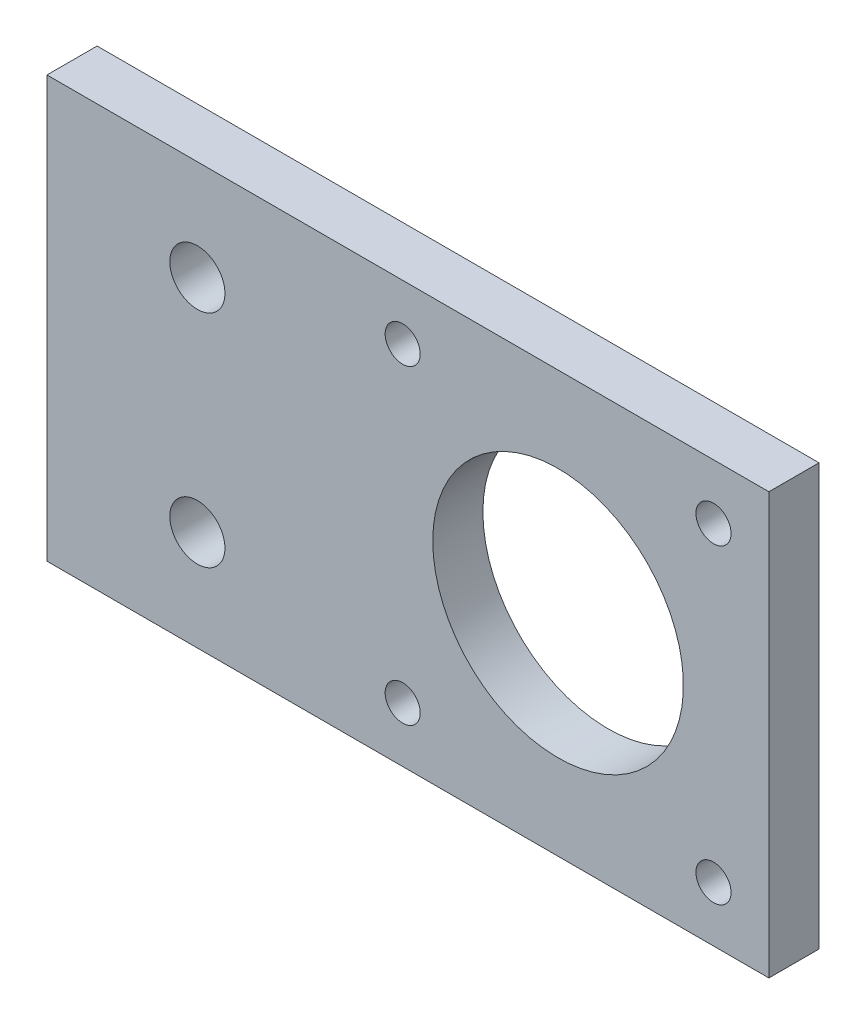
ISO-10303-21;
HEADER;
FILE_DESCRIPTION(('STEP AP214'),'2;1');
FILE_NAME('part.step','',(''),(''),'','','');
FILE_SCHEMA(('AUTOMOTIVE_DESIGN { 1 0 10303 214 1 1 1 1 }'));
ENDSEC;
DATA;
#1=APPLICATION_CONTEXT('core data for automotive mechanical design processes');
#2=APPLICATION_PROTOCOL_DEFINITION('international standard','automotive_design',2000,#1);
#3=PRODUCT_CONTEXT('',#1,'mechanical');
#4=PRODUCT('Part','Part','',(#3));
#5=PRODUCT_RELATED_PRODUCT_CATEGORY('part','',(#4));
#6=PRODUCT_DEFINITION_FORMATION('','',#4);
#7=PRODUCT_DEFINITION_CONTEXT('part definition',#1,'design');
#8=PRODUCT_DEFINITION('design','',#6,#7);
#9=PRODUCT_DEFINITION_SHAPE('','',#8);
#10=(LENGTH_UNIT() NAMED_UNIT(*) SI_UNIT(.MILLI.,.METRE.));
#11=(NAMED_UNIT(*) PLANE_ANGLE_UNIT() SI_UNIT($,.RADIAN.));
#12=(NAMED_UNIT(*) SI_UNIT($,.STERADIAN.) SOLID_ANGLE_UNIT());
#13=UNCERTAINTY_MEASURE_WITH_UNIT(LENGTH_MEASURE(1.E-05),#10,'distance_accuracy_value','');
#14=(GEOMETRIC_REPRESENTATION_CONTEXT(3) GLOBAL_UNCERTAINTY_ASSIGNED_CONTEXT((#13)) GLOBAL_UNIT_ASSIGNED_CONTEXT((#10,
#11,#12)) REPRESENTATION_CONTEXT('',''));
#15=CARTESIAN_POINT('',(0.,0.,0.));
#16=DIRECTION('',(0.,0.,1.));
#17=DIRECTION('',(1.,0.,0.));
#18=AXIS2_PLACEMENT_3D('',#15,#16,#17);
#19=CARTESIAN_POINT('',(-36.,-21.,5.));
#20=DIRECTION('',(1.,0.,0.));
#21=DIRECTION('',(0.,0.,-1.));
#22=AXIS2_PLACEMENT_3D('',#19,#20,#21);
#23=PLANE('',#22);
#24=DIRECTION('',(0.,-1.,0.));
#25=VECTOR('',#24,1.);
#26=CARTESIAN_POINT('',(-36.,-21.,0.));
#27=LINE('',#26,#25);
#28=CARTESIAN_POINT('',(-36.,21.,0.));
#29=VERTEX_POINT('',#28);
#30=CARTESIAN_POINT('',(-36.,-21.,0.));
#31=VERTEX_POINT('',#30);
#32=EDGE_CURVE('E206',#29,#31,#27,.T.);
#33=ORIENTED_EDGE('',*,*,#32,.T.);
#34=DIRECTION('',(0.,0.,-1.));
#35=VECTOR('',#34,1.);
#36=CARTESIAN_POINT('',(-36.,-21.,5.));
#37=LINE('',#36,#35);
#38=CARTESIAN_POINT('',(-36.,-21.,5.));
#39=VERTEX_POINT('',#38);
#40=EDGE_CURVE('E12',#39,#31,#37,.T.);
#41=ORIENTED_EDGE('',*,*,#40,.F.);
#42=DIRECTION('',(0.,-1.,0.));
#43=VECTOR('',#42,1.);
#44=CARTESIAN_POINT('',(-36.,-21.,5.));
#45=LINE('',#44,#43);
#46=CARTESIAN_POINT('',(-36.,21.,5.));
#47=VERTEX_POINT('',#46);
#48=EDGE_CURVE('E102',#47,#39,#45,.T.);
#49=ORIENTED_EDGE('',*,*,#48,.F.);
#50=DIRECTION('',(0.,0.,-1.));
#51=VECTOR('',#50,1.);
#52=CARTESIAN_POINT('',(-36.,21.,5.));
#53=LINE('',#52,#51);
#54=EDGE_CURVE('E115',#47,#29,#53,.T.);
#55=ORIENTED_EDGE('',*,*,#54,.T.);
#56=EDGE_LOOP('',(#33,#41,#49,#55));
#57=FACE_BOUND('',#56,.T.);
#58=ADVANCED_FACE('F48',(#57),#23,.F.);
#59=CARTESIAN_POINT('',(36.,-21.,5.));
#60=DIRECTION('',(0.,1.,0.));
#61=DIRECTION('',(-1.,0.,0.));
#62=AXIS2_PLACEMENT_3D('',#59,#60,#61);
#63=PLANE('',#62);
#64=DIRECTION('',(1.,0.,0.));
#65=VECTOR('',#64,1.);
#66=CARTESIAN_POINT('',(36.,-21.,0.));
#67=LINE('',#66,#65);
#68=CARTESIAN_POINT('',(36.,-21.,0.));
#69=VERTEX_POINT('',#68);
#70=EDGE_CURVE('E107',#31,#69,#67,.T.);
#71=ORIENTED_EDGE('',*,*,#70,.T.);
#72=DIRECTION('',(0.,0.,-1.));
#73=VECTOR('',#72,1.);
#74=CARTESIAN_POINT('',(36.,-21.,5.));
#75=LINE('',#74,#73);
#76=CARTESIAN_POINT('',(36.,-21.,5.));
#77=VERTEX_POINT('',#76);
#78=EDGE_CURVE('E58',#77,#69,#75,.T.);
#79=ORIENTED_EDGE('',*,*,#78,.F.);
#80=DIRECTION('',(1.,0.,0.));
#81=VECTOR('',#80,1.);
#82=CARTESIAN_POINT('',(36.,-21.,5.));
#83=LINE('',#82,#81);
#84=EDGE_CURVE('E97',#39,#77,#83,.T.);
#85=ORIENTED_EDGE('',*,*,#84,.F.);
#86=ORIENTED_EDGE('',*,*,#40,.T.);
#87=EDGE_LOOP('',(#71,#79,#85,#86));
#88=FACE_BOUND('',#87,.T.);
#89=ADVANCED_FACE('F106',(#88),#63,.F.);
#90=CARTESIAN_POINT('',(36.,-21.,5.));
#91=DIRECTION('',(-1.,0.,0.));
#92=DIRECTION('',(0.,-1.,0.));
#93=AXIS2_PLACEMENT_3D('',#90,#91,#92);
#94=PLANE('',#93);
#95=DIRECTION('',(0.,1.,0.));
#96=VECTOR('',#95,1.);
#97=CARTESIAN_POINT('',(36.,-21.,0.));
#98=LINE('',#97,#96);
#99=CARTESIAN_POINT('',(36.,21.,0.));
#100=VERTEX_POINT('',#99);
#101=EDGE_CURVE('E84',#69,#100,#98,.T.);
#102=ORIENTED_EDGE('',*,*,#101,.T.);
#103=DIRECTION('',(0.,0.,-1.));
#104=VECTOR('',#103,1.);
#105=CARTESIAN_POINT('',(36.,21.,5.));
#106=LINE('',#105,#104);
#107=CARTESIAN_POINT('',(36.,21.,5.));
#108=VERTEX_POINT('',#107);
#109=EDGE_CURVE('E109',#108,#100,#106,.T.);
#110=ORIENTED_EDGE('',*,*,#109,.F.);
#111=DIRECTION('',(0.,1.,0.));
#112=VECTOR('',#111,1.);
#113=CARTESIAN_POINT('',(36.,-21.,5.));
#114=LINE('',#113,#112);
#115=EDGE_CURVE('E100',#77,#108,#114,.T.);
#116=ORIENTED_EDGE('',*,*,#115,.F.);
#117=ORIENTED_EDGE('',*,*,#78,.T.);
#118=EDGE_LOOP('',(#102,#110,#116,#117));
#119=FACE_BOUND('',#118,.T.);
#120=ADVANCED_FACE('F111',(#119),#94,.F.);
#121=CARTESIAN_POINT('',(36.,21.,5.));
#122=DIRECTION('',(0.,-1.,0.));
#123=DIRECTION('',(1.,0.,0.));
#124=AXIS2_PLACEMENT_3D('',#121,#122,#123);
#125=PLANE('',#124);
#126=DIRECTION('',(-1.,0.,0.));
#127=VECTOR('',#126,1.);
#128=CARTESIAN_POINT('',(36.,21.,0.));
#129=LINE('',#128,#127);
#130=EDGE_CURVE('E90',#100,#29,#129,.T.);
#131=ORIENTED_EDGE('',*,*,#130,.T.);
#132=ORIENTED_EDGE('',*,*,#54,.F.);
#133=DIRECTION('',(-1.,0.,0.));
#134=VECTOR('',#133,1.);
#135=CARTESIAN_POINT('',(36.,21.,5.));
#136=LINE('',#135,#134);
#137=EDGE_CURVE('E67',#108,#47,#136,.T.);
#138=ORIENTED_EDGE('',*,*,#137,.F.);
#139=ORIENTED_EDGE('',*,*,#109,.T.);
#140=EDGE_LOOP('',(#131,#132,#138,#139));
#141=FACE_BOUND('',#140,.T.);
#142=ADVANCED_FACE('F252',(#141),#125,.F.);
#143=CARTESIAN_POINT('',(0.,0.,5.));
#144=DIRECTION('',(0.,0.,1.));
#145=DIRECTION('',(1.,0.,0.));
#146=AXIS2_PLACEMENT_3D('',#143,#144,#145);
#147=PLANE('',#146);
#148=CARTESIAN_POINT('',(14.9749999999974,1.99840144432528E-12,5.));
#149=DIRECTION('',(0.,0.,-1.));
#150=DIRECTION('',(-1.,0.,0.));
#151=AXIS2_PLACEMENT_3D('',#148,#149,#150);
#152=CIRCLE('',#151,12.50000000003);
#153=CARTESIAN_POINT('',(2.4749999999674,1.99840144432528E-12,5.));
#154=VERTEX_POINT('',#153);
#155=EDGE_CURVE('E169',#154,#154,#152,.T.);
#156=ORIENTED_EDGE('',*,*,#155,.T.);
#157=EDGE_LOOP('',(#156));
#158=FACE_BOUND('',#157,.T.);
#159=CARTESIAN_POINT('',(-21.,11.,5.));
#160=DIRECTION('',(0.,0.,-1.));
#161=DIRECTION('',(-1.,0.,0.));
#162=AXIS2_PLACEMENT_3D('',#159,#160,#161);
#163=CIRCLE('',#162,2.75);
#164=CARTESIAN_POINT('',(-23.75,11.,5.));
#165=VERTEX_POINT('',#164);
#166=EDGE_CURVE('E160',#165,#165,#163,.T.);
#167=ORIENTED_EDGE('',*,*,#166,.T.);
#168=EDGE_LOOP('',(#167));
#169=FACE_BOUND('',#168,.T.);
#170=CARTESIAN_POINT('',(-21.,-11.,5.));
#171=DIRECTION('',(0.,0.,-1.));
#172=DIRECTION('',(-1.,0.,0.));
#173=AXIS2_PLACEMENT_3D('',#170,#171,#172);
#174=CIRCLE('',#173,2.75);
#175=CARTESIAN_POINT('',(-23.75,-11.,5.));
#176=VERTEX_POINT('',#175);
#177=EDGE_CURVE('E141',#176,#176,#174,.T.);
#178=ORIENTED_EDGE('',*,*,#177,.T.);
#179=EDGE_LOOP('',(#178));
#180=FACE_BOUND('',#179,.T.);
#181=CARTESIAN_POINT('',(-0.525000000002595,15.5000000000002,5.));
#182=DIRECTION('',(0.,0.,1.));
#183=DIRECTION('',(1.,0.,0.));
#184=AXIS2_PLACEMENT_3D('',#181,#182,#183);
#185=CIRCLE('',#184,1.75);
#186=CARTESIAN_POINT('',(1.2249999999974,15.5000000000002,5.));
#187=VERTEX_POINT('',#186);
#188=EDGE_CURVE('E135',#187,#187,#185,.T.);
#189=ORIENTED_EDGE('',*,*,#188,.F.);
#190=EDGE_LOOP('',(#189));
#191=FACE_BOUND('',#190,.T.);
#192=CARTESIAN_POINT('',(-0.525000000002596,-15.4999999999998,5.));
#193=DIRECTION('',(0.,0.,1.));
#194=DIRECTION('',(1.,0.,0.));
#195=AXIS2_PLACEMENT_3D('',#192,#193,#194);
#196=CIRCLE('',#195,1.75);
#197=CARTESIAN_POINT('',(1.2249999999974,-15.4999999999998,5.));
#198=VERTEX_POINT('',#197);
#199=EDGE_CURVE('E140',#198,#198,#196,.T.);
#200=ORIENTED_EDGE('',*,*,#199,.F.);
#201=EDGE_LOOP('',(#200));
#202=FACE_BOUND('',#201,.T.);
#203=CARTESIAN_POINT('',(30.4749999999974,-15.4999999999998,5.));
#204=DIRECTION('',(0.,0.,1.));
#205=DIRECTION('',(1.,0.,0.));
#206=AXIS2_PLACEMENT_3D('',#203,#204,#205);
#207=CIRCLE('',#206,1.75);
#208=CARTESIAN_POINT('',(32.2249999999974,-15.4999999999998,5.));
#209=VERTEX_POINT('',#208);
#210=EDGE_CURVE('E134',#209,#209,#207,.T.);
#211=ORIENTED_EDGE('',*,*,#210,.F.);
#212=EDGE_LOOP('',(#211));
#213=FACE_BOUND('',#212,.T.);
#214=CARTESIAN_POINT('',(30.4749999999974,15.5000000000002,5.));
#215=DIRECTION('',(0.,0.,1.));
#216=DIRECTION('',(1.,0.,0.));
#217=AXIS2_PLACEMENT_3D('',#214,#215,#216);
#218=CIRCLE('',#217,1.75);
#219=CARTESIAN_POINT('',(32.2249999999974,15.5000000000002,5.));
#220=VERTEX_POINT('',#219);
#221=EDGE_CURVE('E128',#220,#220,#218,.T.);
#222=ORIENTED_EDGE('',*,*,#221,.F.);
#223=EDGE_LOOP('',(#222));
#224=FACE_BOUND('',#223,.T.);
#225=ORIENTED_EDGE('',*,*,#48,.T.);
#226=ORIENTED_EDGE('',*,*,#84,.T.);
#227=ORIENTED_EDGE('',*,*,#115,.T.);
#228=ORIENTED_EDGE('',*,*,#137,.T.);
#229=EDGE_LOOP('',(#225,#226,#227,#228));
#230=FACE_BOUND('',#229,.T.);
#231=ADVANCED_FACE('F98',(#158,#169,#180,#191,#202,#213,#224,#230),#147,.T.);
#232=CARTESIAN_POINT('',(0.,0.,0.));
#233=DIRECTION('',(0.,0.,1.));
#234=DIRECTION('',(1.,0.,0.));
#235=AXIS2_PLACEMENT_3D('',#232,#233,#234);
#236=PLANE('',#235);
#237=CARTESIAN_POINT('',(14.9749999999974,1.99840144432528E-12,0.));
#238=DIRECTION('',(0.,0.,-1.));
#239=DIRECTION('',(-1.,0.,0.));
#240=AXIS2_PLACEMENT_3D('',#237,#238,#239);
#241=CIRCLE('',#240,12.50000000003);
#242=CARTESIAN_POINT('',(2.4749999999674,1.99840144432528E-12,0.));
#243=VERTEX_POINT('',#242);
#244=EDGE_CURVE('E173',#243,#243,#241,.T.);
#245=ORIENTED_EDGE('',*,*,#244,.F.);
#246=EDGE_LOOP('',(#245));
#247=FACE_BOUND('',#246,.T.);
#248=CARTESIAN_POINT('',(-21.,11.,0.));
#249=DIRECTION('',(0.,0.,-1.));
#250=DIRECTION('',(-1.,0.,0.));
#251=AXIS2_PLACEMENT_3D('',#248,#249,#250);
#252=CIRCLE('',#251,2.75);
#253=CARTESIAN_POINT('',(-23.75,11.,0.));
#254=VERTEX_POINT('',#253);
#255=EDGE_CURVE('E165',#254,#254,#252,.T.);
#256=ORIENTED_EDGE('',*,*,#255,.F.);
#257=EDGE_LOOP('',(#256));
#258=FACE_BOUND('',#257,.T.);
#259=CARTESIAN_POINT('',(-21.,-11.,0.));
#260=DIRECTION('',(0.,0.,-1.));
#261=DIRECTION('',(-1.,0.,0.));
#262=AXIS2_PLACEMENT_3D('',#259,#260,#261);
#263=CIRCLE('',#262,2.75);
#264=CARTESIAN_POINT('',(-23.75,-11.,0.));
#265=VERTEX_POINT('',#264);
#266=EDGE_CURVE('E156',#265,#265,#263,.T.);
#267=ORIENTED_EDGE('',*,*,#266,.F.);
#268=EDGE_LOOP('',(#267));
#269=FACE_BOUND('',#268,.T.);
#270=CARTESIAN_POINT('',(-0.525000000002595,15.5000000000002,0.));
#271=DIRECTION('',(0.,0.,1.));
#272=DIRECTION('',(1.,0.,0.));
#273=AXIS2_PLACEMENT_3D('',#270,#271,#272);
#274=CIRCLE('',#273,1.75);
#275=CARTESIAN_POINT('',(1.2249999999974,15.5000000000002,0.));
#276=VERTEX_POINT('',#275);
#277=EDGE_CURVE('E51',#276,#276,#274,.T.);
#278=ORIENTED_EDGE('',*,*,#277,.T.);
#279=EDGE_LOOP('',(#278));
#280=FACE_BOUND('',#279,.T.);
#281=CARTESIAN_POINT('',(-0.525000000002596,-15.4999999999998,0.));
#282=DIRECTION('',(0.,0.,1.));
#283=DIRECTION('',(1.,0.,0.));
#284=AXIS2_PLACEMENT_3D('',#281,#282,#283);
#285=CIRCLE('',#284,1.75);
#286=CARTESIAN_POINT('',(1.2249999999974,-15.4999999999998,0.));
#287=VERTEX_POINT('',#286);
#288=EDGE_CURVE('E196',#287,#287,#285,.T.);
#289=ORIENTED_EDGE('',*,*,#288,.T.);
#290=EDGE_LOOP('',(#289));
#291=FACE_BOUND('',#290,.T.);
#292=CARTESIAN_POINT('',(30.4749999999974,-15.4999999999998,0.));
#293=DIRECTION('',(0.,0.,1.));
#294=DIRECTION('',(1.,0.,0.));
#295=AXIS2_PLACEMENT_3D('',#292,#293,#294);
#296=CIRCLE('',#295,1.75);
#297=CARTESIAN_POINT('',(32.2249999999974,-15.4999999999998,0.));
#298=VERTEX_POINT('',#297);
#299=EDGE_CURVE('E200',#298,#298,#296,.T.);
#300=ORIENTED_EDGE('',*,*,#299,.T.);
#301=EDGE_LOOP('',(#300));
#302=FACE_BOUND('',#301,.T.);
#303=CARTESIAN_POINT('',(30.4749999999974,15.5000000000002,0.));
#304=DIRECTION('',(0.,0.,1.));
#305=DIRECTION('',(1.,0.,0.));
#306=AXIS2_PLACEMENT_3D('',#303,#304,#305);
#307=CIRCLE('',#306,1.75);
#308=CARTESIAN_POINT('',(32.2249999999974,15.5000000000002,0.));
#309=VERTEX_POINT('',#308);
#310=EDGE_CURVE('E133',#309,#309,#307,.T.);
#311=ORIENTED_EDGE('',*,*,#310,.T.);
#312=EDGE_LOOP('',(#311));
#313=FACE_BOUND('',#312,.T.);
#314=ORIENTED_EDGE('',*,*,#32,.F.);
#315=ORIENTED_EDGE('',*,*,#130,.F.);
#316=ORIENTED_EDGE('',*,*,#101,.F.);
#317=ORIENTED_EDGE('',*,*,#70,.F.);
#318=EDGE_LOOP('',(#314,#315,#316,#317));
#319=FACE_BOUND('',#318,.T.);
#320=ADVANCED_FACE('F180',(#247,#258,#269,#280,#291,#302,#313,#319),#236,.F.);
#321=CARTESIAN_POINT('',(30.4749999999974,15.5000000000002,-5.));
#322=DIRECTION('',(0.,0.,1.));
#323=DIRECTION('',(1.,0.,0.));
#324=AXIS2_PLACEMENT_3D('',#321,#322,#323);
#325=CYLINDRICAL_SURFACE('',#324,1.75);
#326=ORIENTED_EDGE('',*,*,#221,.T.);
#327=EDGE_LOOP('',(#326));
#328=FACE_BOUND('',#327,.T.);
#329=ORIENTED_EDGE('',*,*,#310,.F.);
#330=EDGE_LOOP('',(#329));
#331=FACE_BOUND('',#330,.T.);
#332=ADVANCED_FACE('F183',(#328,#331),#325,.F.);
#333=CARTESIAN_POINT('',(30.4749999999974,-15.4999999999998,-5.));
#334=DIRECTION('',(0.,0.,1.));
#335=DIRECTION('',(1.,0.,0.));
#336=AXIS2_PLACEMENT_3D('',#333,#334,#335);
#337=CYLINDRICAL_SURFACE('',#336,1.75);
#338=ORIENTED_EDGE('',*,*,#210,.T.);
#339=EDGE_LOOP('',(#338));
#340=FACE_BOUND('',#339,.T.);
#341=ORIENTED_EDGE('',*,*,#299,.F.);
#342=EDGE_LOOP('',(#341));
#343=FACE_BOUND('',#342,.T.);
#344=ADVANCED_FACE('F261',(#340,#343),#337,.F.);
#345=CARTESIAN_POINT('',(-0.525000000002596,-15.4999999999998,-5.));
#346=DIRECTION('',(0.,0.,1.));
#347=DIRECTION('',(1.,0.,0.));
#348=AXIS2_PLACEMENT_3D('',#345,#346,#347);
#349=CYLINDRICAL_SURFACE('',#348,1.75);
#350=ORIENTED_EDGE('',*,*,#199,.T.);
#351=EDGE_LOOP('',(#350));
#352=FACE_BOUND('',#351,.T.);
#353=ORIENTED_EDGE('',*,*,#288,.F.);
#354=EDGE_LOOP('',(#353));
#355=FACE_BOUND('',#354,.T.);
#356=ADVANCED_FACE('F265',(#352,#355),#349,.F.);
#357=CARTESIAN_POINT('',(-0.525000000002595,15.5000000000002,-5.));
#358=DIRECTION('',(0.,0.,1.));
#359=DIRECTION('',(1.,0.,0.));
#360=AXIS2_PLACEMENT_3D('',#357,#358,#359);
#361=CYLINDRICAL_SURFACE('',#360,1.75);
#362=ORIENTED_EDGE('',*,*,#188,.T.);
#363=EDGE_LOOP('',(#362));
#364=FACE_BOUND('',#363,.T.);
#365=ORIENTED_EDGE('',*,*,#277,.F.);
#366=EDGE_LOOP('',(#365));
#367=FACE_BOUND('',#366,.T.);
#368=ADVANCED_FACE('F241',(#364,#367),#361,.F.);
#369=CARTESIAN_POINT('',(-21.,-11.,0.));
#370=DIRECTION('',(0.,0.,-1.));
#371=DIRECTION('',(-1.,0.,0.));
#372=AXIS2_PLACEMENT_3D('',#369,#370,#371);
#373=CYLINDRICAL_SURFACE('',#372,2.75);
#374=ORIENTED_EDGE('',*,*,#177,.F.);
#375=EDGE_LOOP('',(#374));
#376=FACE_BOUND('',#375,.T.);
#377=ORIENTED_EDGE('',*,*,#266,.T.);
#378=EDGE_LOOP('',(#377));
#379=FACE_BOUND('',#378,.T.);
#380=ADVANCED_FACE('F231',(#376,#379),#373,.F.);
#381=CARTESIAN_POINT('',(-21.,11.,0.));
#382=DIRECTION('',(0.,0.,-1.));
#383=DIRECTION('',(-1.,0.,0.));
#384=AXIS2_PLACEMENT_3D('',#381,#382,#383);
#385=CYLINDRICAL_SURFACE('',#384,2.75);
#386=ORIENTED_EDGE('',*,*,#166,.F.);
#387=EDGE_LOOP('',(#386));
#388=FACE_BOUND('',#387,.T.);
#389=ORIENTED_EDGE('',*,*,#255,.T.);
#390=EDGE_LOOP('',(#389));
#391=FACE_BOUND('',#390,.T.);
#392=ADVANCED_FACE('F229',(#388,#391),#385,.F.);
#393=CARTESIAN_POINT('',(14.9749999999974,1.99840144432528E-12,5.));
#394=DIRECTION('',(0.,0.,-1.));
#395=DIRECTION('',(-1.,0.,0.));
#396=AXIS2_PLACEMENT_3D('',#393,#394,#395);
#397=CYLINDRICAL_SURFACE('',#396,12.50000000003);
#398=ORIENTED_EDGE('',*,*,#155,.F.);
#399=EDGE_LOOP('',(#398));
#400=FACE_BOUND('',#399,.T.);
#401=ORIENTED_EDGE('',*,*,#244,.T.);
#402=EDGE_LOOP('',(#401));
#403=FACE_BOUND('',#402,.T.);
#404=ADVANCED_FACE('F178',(#400,#403),#397,.F.);
#405=CLOSED_SHELL('',(#58,#89,#120,#142,#231,#320,#332,#344,#356,#368,#380,#392,#404));
#406=MANIFOLD_SOLID_BREP('B2',#405);
#407=ADVANCED_BREP_SHAPE_REPRESENTATION('',(#18,#406),#14);
#408=SHAPE_DEFINITION_REPRESENTATION(#9,#407);
ENDSEC;
END-ISO-10303-21;
